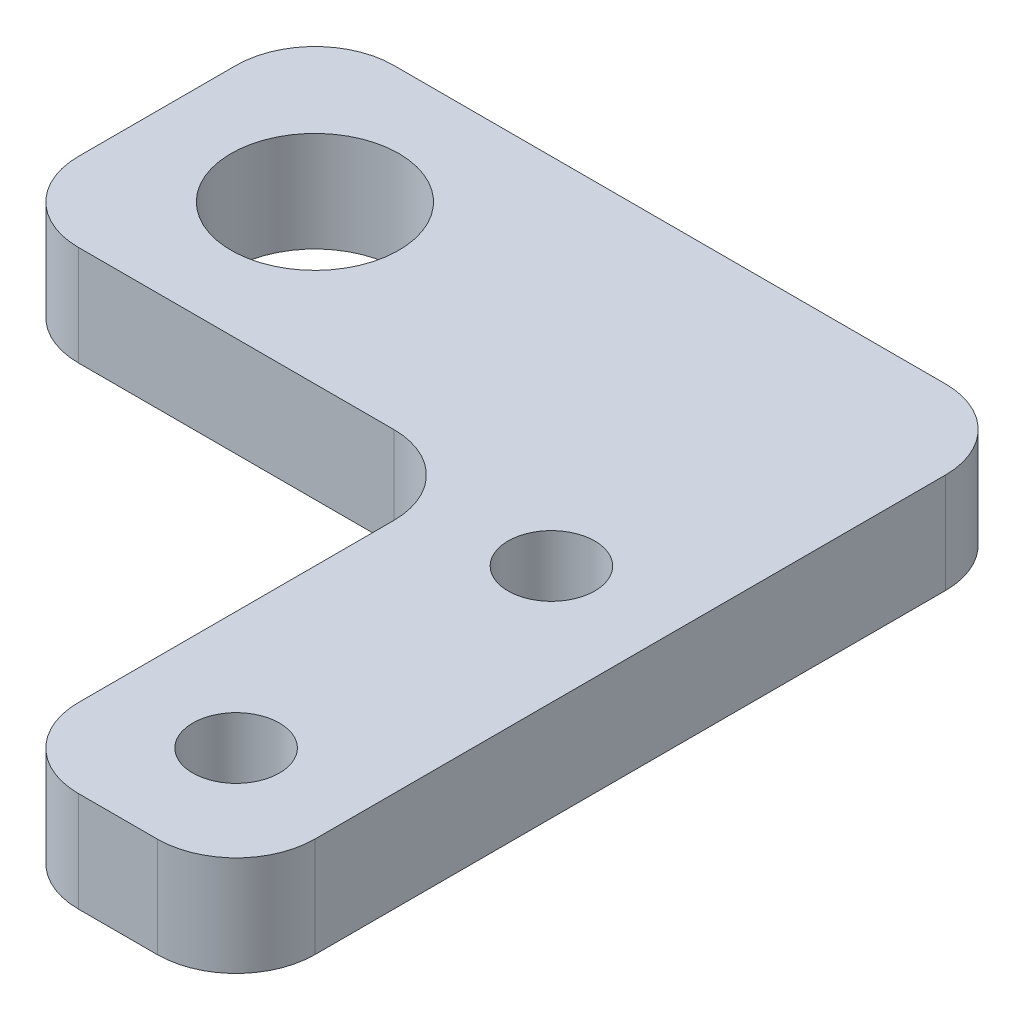
ISO-10303-21;
HEADER;
FILE_DESCRIPTION(('STEP AP214'),'2;1');
FILE_NAME('part.step','',(''),(''),'','','');
FILE_SCHEMA(('AUTOMOTIVE_DESIGN { 1 0 10303 214 1 1 1 1 }'));
ENDSEC;
DATA;
#1=APPLICATION_CONTEXT('core data for automotive mechanical design processes');
#2=APPLICATION_PROTOCOL_DEFINITION('international standard','automotive_design',2000,#1);
#3=PRODUCT_CONTEXT('',#1,'mechanical');
#4=PRODUCT('Part','Part','',(#3));
#5=PRODUCT_RELATED_PRODUCT_CATEGORY('part','',(#4));
#6=PRODUCT_DEFINITION_FORMATION('','',#4);
#7=PRODUCT_DEFINITION_CONTEXT('part definition',#1,'design');
#8=PRODUCT_DEFINITION('design','',#6,#7);
#9=PRODUCT_DEFINITION_SHAPE('','',#8);
#10=(LENGTH_UNIT() NAMED_UNIT(*) SI_UNIT(.MILLI.,.METRE.));
#11=(NAMED_UNIT(*) PLANE_ANGLE_UNIT() SI_UNIT($,.RADIAN.));
#12=(NAMED_UNIT(*) SI_UNIT($,.STERADIAN.) SOLID_ANGLE_UNIT());
#13=UNCERTAINTY_MEASURE_WITH_UNIT(LENGTH_MEASURE(1.E-05),#10,'distance_accuracy_value','');
#14=(GEOMETRIC_REPRESENTATION_CONTEXT(3) GLOBAL_UNCERTAINTY_ASSIGNED_CONTEXT((#13)) GLOBAL_UNIT_ASSIGNED_CONTEXT((#10,
#11,#12)) REPRESENTATION_CONTEXT('',''));
#15=CARTESIAN_POINT('',(0.,0.,0.));
#16=DIRECTION('',(0.,0.,1.));
#17=DIRECTION('',(1.,0.,0.));
#18=AXIS2_PLACEMENT_3D('',#15,#16,#17);
#19=CARTESIAN_POINT('',(486.716259782273,6.35,239.350956887398));
#20=DIRECTION('',(0.,1.,0.));
#21=DIRECTION('',(1.,0.,0.));
#22=AXIS2_PLACEMENT_3D('',#19,#20,#21);
#23=PLANE('',#22);
#24=CARTESIAN_POINT('',(474.216259782273,6.35,224.350956887398));
#25=DIRECTION('',(0.,-1.,0.));
#26=DIRECTION('',(0.,0.,1.));
#27=AXIS2_PLACEMENT_3D('',#24,#25,#26);
#28=CIRCLE('',#27,5.3213);
#29=CARTESIAN_POINT('',(474.216259782273,6.35,219.029656887398));
#30=VERTEX_POINT('',#29);
#31=EDGE_CURVE('E324',#30,#30,#28,.T.);
#32=ORIENTED_EDGE('',*,*,#31,.T.);
#33=EDGE_LOOP('',(#32));
#34=FACE_BOUND('',#33,.T.);
#35=CARTESIAN_POINT('',(501.716259782273,6.35,256.850956887398));
#36=DIRECTION('',(0.,-1.,0.));
#37=DIRECTION('',(0.,0.,1.));
#38=AXIS2_PLACEMENT_3D('',#35,#36,#37);
#39=CIRCLE('',#38,2.75);
#40=CARTESIAN_POINT('',(501.716259782273,6.35,254.100956887398));
#41=VERTEX_POINT('',#40);
#42=EDGE_CURVE('E202',#41,#41,#39,.T.);
#43=ORIENTED_EDGE('',*,*,#42,.T.);
#44=EDGE_LOOP('',(#43));
#45=FACE_BOUND('',#44,.T.);
#46=CARTESIAN_POINT('',(501.716259782273,6.35,236.850956887398));
#47=DIRECTION('',(0.,-1.,0.));
#48=DIRECTION('',(0.,0.,1.));
#49=AXIS2_PLACEMENT_3D('',#46,#47,#48);
#50=CIRCLE('',#49,2.75);
#51=CARTESIAN_POINT('',(501.716259782273,6.35,234.100956887398));
#52=VERTEX_POINT('',#51);
#53=EDGE_CURVE('E320',#52,#52,#50,.T.);
#54=ORIENTED_EDGE('',*,*,#53,.T.);
#55=EDGE_LOOP('',(#54));
#56=FACE_BOUND('',#55,.T.);
#57=CARTESIAN_POINT('',(504.216259782273,6.35,259.350956887398));
#58=DIRECTION('',(0.,-1.,0.));
#59=DIRECTION('',(0.707106781186548,0.,0.707106781186548));
#60=AXIS2_PLACEMENT_3D('',#57,#58,#59);
#61=CIRCLE('',#60,5.);
#62=CARTESIAN_POINT('',(509.216259782273,6.35,259.350956887398));
#63=VERTEX_POINT('',#62);
#64=CARTESIAN_POINT('',(504.216259782273,6.35,264.350956887398));
#65=VERTEX_POINT('',#64);
#66=EDGE_CURVE('E218',#63,#65,#61,.T.);
#67=ORIENTED_EDGE('',*,*,#66,.F.);
#68=DIRECTION('',(0.,0.,-1.));
#69=VECTOR('',#68,1.);
#70=CARTESIAN_POINT('',(509.216259782273,6.35,214.350956887398));
#71=LINE('',#70,#69);
#72=CARTESIAN_POINT('',(509.216259782273,6.35,219.350956887398));
#73=VERTEX_POINT('',#72);
#74=EDGE_CURVE('E10',#63,#73,#71,.T.);
#75=ORIENTED_EDGE('',*,*,#74,.T.);
#76=CARTESIAN_POINT('',(504.216259782273,6.35,219.350956887398));
#77=DIRECTION('',(0.,-1.,0.));
#78=DIRECTION('',(0.707106781186548,0.,-0.707106781186548));
#79=AXIS2_PLACEMENT_3D('',#76,#77,#78);
#80=CIRCLE('',#79,5.);
#81=CARTESIAN_POINT('',(504.216259782273,6.35,214.350956887398));
#82=VERTEX_POINT('',#81);
#83=EDGE_CURVE('E293',#82,#73,#80,.T.);
#84=ORIENTED_EDGE('',*,*,#83,.F.);
#85=DIRECTION('',(-1.,0.,0.));
#86=VECTOR('',#85,1.);
#87=CARTESIAN_POINT('',(464.216259782273,6.35,214.350956887398));
#88=LINE('',#87,#86);
#89=CARTESIAN_POINT('',(469.216259782273,6.35,214.350956887398));
#90=VERTEX_POINT('',#89);
#91=EDGE_CURVE('E224',#82,#90,#88,.T.);
#92=ORIENTED_EDGE('',*,*,#91,.T.);
#93=CARTESIAN_POINT('',(469.216259782273,6.35,219.350956887398));
#94=DIRECTION('',(0.,-1.,0.));
#95=DIRECTION('',(-0.707106781186548,0.,-0.707106781186548));
#96=AXIS2_PLACEMENT_3D('',#93,#94,#95);
#97=CIRCLE('',#96,5.);
#98=CARTESIAN_POINT('',(464.216259782273,6.35,219.350956887398));
#99=VERTEX_POINT('',#98);
#100=EDGE_CURVE('E227',#99,#90,#97,.T.);
#101=ORIENTED_EDGE('',*,*,#100,.F.);
#102=DIRECTION('',(0.,0.,1.));
#103=VECTOR('',#102,1.);
#104=CARTESIAN_POINT('',(464.216259782273,6.35,264.350956887398));
#105=LINE('',#104,#103);
#106=CARTESIAN_POINT('',(464.216259782273,6.35,229.350956887398));
#107=VERTEX_POINT('',#106);
#108=EDGE_CURVE('E264',#99,#107,#105,.T.);
#109=ORIENTED_EDGE('',*,*,#108,.T.);
#110=CARTESIAN_POINT('',(469.216259782273,6.35,229.350956887398));
#111=DIRECTION('',(0.,-1.,0.));
#112=DIRECTION('',(-0.707106781186548,0.,0.707106781186548));
#113=AXIS2_PLACEMENT_3D('',#110,#111,#112);
#114=CIRCLE('',#113,5.);
#115=CARTESIAN_POINT('',(469.216259782273,6.35,234.350956887398));
#116=VERTEX_POINT('',#115);
#117=EDGE_CURVE('E265',#116,#107,#114,.T.);
#118=ORIENTED_EDGE('',*,*,#117,.F.);
#119=DIRECTION('',(1.,0.,0.));
#120=VECTOR('',#119,1.);
#121=CARTESIAN_POINT('',(494.216259782273,6.35,234.350956887398));
#122=LINE('',#121,#120);
#123=CARTESIAN_POINT('',(489.216259782273,6.35,234.350956887398));
#124=VERTEX_POINT('',#123);
#125=EDGE_CURVE('E24',#116,#124,#122,.T.);
#126=ORIENTED_EDGE('',*,*,#125,.T.);
#127=CARTESIAN_POINT('',(489.216259782273,6.35,239.350956887398));
#128=DIRECTION('',(0.,1.,0.));
#129=DIRECTION('',(0.707106781186548,0.,-0.707106781186548));
#130=AXIS2_PLACEMENT_3D('',#127,#128,#129);
#131=CIRCLE('',#130,5.);
#132=CARTESIAN_POINT('',(494.216259782273,6.35,239.350956887398));
#133=VERTEX_POINT('',#132);
#134=EDGE_CURVE('E185',#133,#124,#131,.T.);
#135=ORIENTED_EDGE('',*,*,#134,.F.);
#136=DIRECTION('',(0.,0.,1.));
#137=VECTOR('',#136,1.);
#138=CARTESIAN_POINT('',(494.216259782273,6.35,264.350956887398));
#139=LINE('',#138,#137);
#140=CARTESIAN_POINT('',(494.216259782273,6.35,259.350956887398));
#141=VERTEX_POINT('',#140);
#142=EDGE_CURVE('E235',#133,#141,#139,.T.);
#143=ORIENTED_EDGE('',*,*,#142,.T.);
#144=CARTESIAN_POINT('',(499.216259782273,6.35,259.350956887398));
#145=DIRECTION('',(0.,-1.,0.));
#146=DIRECTION('',(-0.707106781186548,0.,0.707106781186548));
#147=AXIS2_PLACEMENT_3D('',#144,#145,#146);
#148=CIRCLE('',#147,5.);
#149=CARTESIAN_POINT('',(499.216259782273,6.35,264.350956887398));
#150=VERTEX_POINT('',#149);
#151=EDGE_CURVE('E289',#150,#141,#148,.T.);
#152=ORIENTED_EDGE('',*,*,#151,.F.);
#153=DIRECTION('',(1.,0.,0.));
#154=VECTOR('',#153,1.);
#155=CARTESIAN_POINT('',(509.216259782273,6.35,264.350956887398));
#156=LINE('',#155,#154);
#157=EDGE_CURVE('E284',#150,#65,#156,.T.);
#158=ORIENTED_EDGE('',*,*,#157,.T.);
#159=EDGE_LOOP('',(#67,#75,#84,#92,#101,#109,#118,#126,#135,#143,#152,#158));
#160=FACE_BOUND('',#159,.T.);
#161=ADVANCED_FACE('F16',(#34,#45,#56,#160),#23,.T.);
#162=CARTESIAN_POINT('',(509.216259782273,0.,264.350956887398));
#163=DIRECTION('',(1.,0.,0.));
#164=DIRECTION('',(0.,1.,0.));
#165=AXIS2_PLACEMENT_3D('',#162,#163,#164);
#166=PLANE('',#165);
#167=DIRECTION('',(0.,1.,0.));
#168=VECTOR('',#167,1.);
#169=CARTESIAN_POINT('',(509.216259782273,0.,259.350956887398));
#170=LINE('',#169,#168);
#171=CARTESIAN_POINT('',(509.216259782273,0.,259.350956887398));
#172=VERTEX_POINT('',#171);
#173=EDGE_CURVE('E213',#172,#63,#170,.T.);
#174=ORIENTED_EDGE('',*,*,#173,.F.);
#175=DIRECTION('',(0.,0.,1.));
#176=VECTOR('',#175,1.);
#177=CARTESIAN_POINT('',(509.216259782273,0.,214.350956887398));
#178=LINE('',#177,#176);
#179=CARTESIAN_POINT('',(509.216259782273,0.,219.350956887398));
#180=VERTEX_POINT('',#179);
#181=EDGE_CURVE('E261',#180,#172,#178,.T.);
#182=ORIENTED_EDGE('',*,*,#181,.F.);
#183=DIRECTION('',(0.,-1.,0.));
#184=VECTOR('',#183,1.);
#185=CARTESIAN_POINT('',(509.216259782273,0.,219.350956887398));
#186=LINE('',#185,#184);
#187=EDGE_CURVE('E300',#73,#180,#186,.T.);
#188=ORIENTED_EDGE('',*,*,#187,.F.);
#189=ORIENTED_EDGE('',*,*,#74,.F.);
#190=EDGE_LOOP('',(#174,#182,#188,#189));
#191=FACE_BOUND('',#190,.T.);
#192=ADVANCED_FACE('F360',(#191),#166,.T.);
#193=CARTESIAN_POINT('',(464.216259782273,0.,234.350956887398));
#194=DIRECTION('',(0.,0.,1.));
#195=DIRECTION('',(1.,0.,0.));
#196=AXIS2_PLACEMENT_3D('',#193,#194,#195);
#197=PLANE('',#196);
#198=DIRECTION('',(0.,-1.,0.));
#199=VECTOR('',#198,1.);
#200=CARTESIAN_POINT('',(489.216259782273,0.,234.350956887398));
#201=LINE('',#200,#199);
#202=CARTESIAN_POINT('',(489.216259782273,0.,234.350956887398));
#203=VERTEX_POINT('',#202);
#204=EDGE_CURVE('E162',#124,#203,#201,.T.);
#205=ORIENTED_EDGE('',*,*,#204,.F.);
#206=ORIENTED_EDGE('',*,*,#125,.F.);
#207=DIRECTION('',(0.,1.,0.));
#208=VECTOR('',#207,1.);
#209=CARTESIAN_POINT('',(469.216259782273,0.,234.350956887398));
#210=LINE('',#209,#208);
#211=CARTESIAN_POINT('',(469.216259782273,0.,234.350956887398));
#212=VERTEX_POINT('',#211);
#213=EDGE_CURVE('E167',#212,#116,#210,.T.);
#214=ORIENTED_EDGE('',*,*,#213,.F.);
#215=DIRECTION('',(-1.,0.,0.));
#216=VECTOR('',#215,1.);
#217=CARTESIAN_POINT('',(494.216259782273,0.,234.350956887398));
#218=LINE('',#217,#216);
#219=EDGE_CURVE('E159',#203,#212,#218,.T.);
#220=ORIENTED_EDGE('',*,*,#219,.F.);
#221=EDGE_LOOP('',(#205,#206,#214,#220));
#222=FACE_BOUND('',#221,.T.);
#223=ADVANCED_FACE('F165',(#222),#197,.T.);
#224=CARTESIAN_POINT('',(474.216259782273,-3.175,224.350956887398));
#225=DIRECTION('',(0.,-1.,0.));
#226=DIRECTION('',(0.,0.,1.));
#227=AXIS2_PLACEMENT_3D('',#224,#225,#226);
#228=CYLINDRICAL_SURFACE('',#227,5.3213);
#229=ORIENTED_EDGE('',*,*,#31,.F.);
#230=DIRECTION('',(0.,-1.,0.));
#231=VECTOR('',#230,1.);
#232=CARTESIAN_POINT('',(474.216259782273,-3.175,219.029656887398));
#233=LINE('',#232,#231);
#234=CARTESIAN_POINT('',(474.216259782273,0.,219.029656887398));
#235=VERTEX_POINT('',#234);
#236=EDGE_CURVE('E38',#30,#235,#233,.T.);
#237=ORIENTED_EDGE('',*,*,#236,.T.);
#238=CARTESIAN_POINT('',(474.216259782273,0.,224.350956887398));
#239=DIRECTION('',(0.,1.,0.));
#240=DIRECTION('',(0.,0.,1.));
#241=AXIS2_PLACEMENT_3D('',#238,#239,#240);
#242=CIRCLE('',#241,5.3213);
#243=EDGE_CURVE('E268',#235,#235,#242,.T.);
#244=ORIENTED_EDGE('',*,*,#243,.F.);
#245=ORIENTED_EDGE('',*,*,#236,.F.);
#246=EDGE_LOOP('',(#229,#237,#244,#245));
#247=FACE_BOUND('',#246,.T.);
#248=ADVANCED_FACE('F398',(#247),#228,.F.);
#249=CARTESIAN_POINT('',(501.716259782273,-5.87374999999971,256.850956887398));
#250=DIRECTION('',(0.,-1.,0.));
#251=DIRECTION('',(0.,0.,1.));
#252=AXIS2_PLACEMENT_3D('',#249,#250,#251);
#253=CYLINDRICAL_SURFACE('',#252,2.75);
#254=ORIENTED_EDGE('',*,*,#42,.F.);
#255=DIRECTION('',(0.,-1.,0.));
#256=VECTOR('',#255,1.);
#257=CARTESIAN_POINT('',(501.716259782273,-5.87374999999971,254.100956887398));
#258=LINE('',#257,#256);
#259=CARTESIAN_POINT('',(501.716259782273,0.,254.100956887398));
#260=VERTEX_POINT('',#259);
#261=EDGE_CURVE('E46',#41,#260,#258,.T.);
#262=ORIENTED_EDGE('',*,*,#261,.T.);
#263=CARTESIAN_POINT('',(501.716259782273,0.,256.850956887398));
#264=DIRECTION('',(0.,1.,0.));
#265=DIRECTION('',(0.,0.,1.));
#266=AXIS2_PLACEMENT_3D('',#263,#264,#265);
#267=CIRCLE('',#266,2.75);
#268=EDGE_CURVE('E274',#260,#260,#267,.T.);
#269=ORIENTED_EDGE('',*,*,#268,.F.);
#270=ORIENTED_EDGE('',*,*,#261,.F.);
#271=EDGE_LOOP('',(#254,#262,#269,#270));
#272=FACE_BOUND('',#271,.T.);
#273=ADVANCED_FACE('F399',(#272),#253,.F.);
#274=CARTESIAN_POINT('',(501.716259782273,-5.87374999999971,236.850956887398));
#275=DIRECTION('',(0.,-1.,0.));
#276=DIRECTION('',(0.,0.,1.));
#277=AXIS2_PLACEMENT_3D('',#274,#275,#276);
#278=CYLINDRICAL_SURFACE('',#277,2.75);
#279=ORIENTED_EDGE('',*,*,#53,.F.);
#280=DIRECTION('',(0.,-1.,0.));
#281=VECTOR('',#280,1.);
#282=CARTESIAN_POINT('',(501.716259782273,-5.87374999999971,234.100956887398));
#283=LINE('',#282,#281);
#284=CARTESIAN_POINT('',(501.716259782273,0.,234.100956887398));
#285=VERTEX_POINT('',#284);
#286=EDGE_CURVE('E208',#52,#285,#283,.T.);
#287=ORIENTED_EDGE('',*,*,#286,.T.);
#288=CARTESIAN_POINT('',(501.716259782273,0.,236.850956887398));
#289=DIRECTION('',(0.,1.,0.));
#290=DIRECTION('',(0.,0.,1.));
#291=AXIS2_PLACEMENT_3D('',#288,#289,#290);
#292=CIRCLE('',#291,2.75);
#293=EDGE_CURVE('E276',#285,#285,#292,.T.);
#294=ORIENTED_EDGE('',*,*,#293,.F.);
#295=ORIENTED_EDGE('',*,*,#286,.F.);
#296=EDGE_LOOP('',(#279,#287,#294,#295));
#297=FACE_BOUND('',#296,.T.);
#298=ADVANCED_FACE('F391',(#297),#278,.F.);
#299=CARTESIAN_POINT('',(469.216259782273,0.,229.350956887398));
#300=DIRECTION('',(0.,1.,0.));
#301=DIRECTION('',(-0.707106781186548,0.,0.707106781186548));
#302=AXIS2_PLACEMENT_3D('',#299,#300,#301);
#303=CYLINDRICAL_SURFACE('',#302,5.);
#304=ORIENTED_EDGE('',*,*,#117,.T.);
#305=DIRECTION('',(0.,-1.,0.));
#306=VECTOR('',#305,1.);
#307=CARTESIAN_POINT('',(464.216259782273,0.,229.350956887398));
#308=LINE('',#307,#306);
#309=CARTESIAN_POINT('',(464.216259782273,0.,229.350956887398));
#310=VERTEX_POINT('',#309);
#311=EDGE_CURVE('E310',#107,#310,#308,.T.);
#312=ORIENTED_EDGE('',*,*,#311,.T.);
#313=CARTESIAN_POINT('',(469.216259782273,0.,229.350956887398));
#314=DIRECTION('',(0.,1.,0.));
#315=DIRECTION('',(-0.707106781186548,0.,0.707106781186548));
#316=AXIS2_PLACEMENT_3D('',#313,#314,#315);
#317=CIRCLE('',#316,5.);
#318=EDGE_CURVE('E172',#310,#212,#317,.T.);
#319=ORIENTED_EDGE('',*,*,#318,.T.);
#320=ORIENTED_EDGE('',*,*,#213,.T.);
#321=EDGE_LOOP('',(#304,#312,#319,#320));
#322=FACE_BOUND('',#321,.T.);
#323=ADVANCED_FACE('F336',(#322),#303,.T.);
#324=CARTESIAN_POINT('',(464.216259782273,0.,214.350956887398));
#325=DIRECTION('',(-1.,0.,0.));
#326=DIRECTION('',(0.,0.,1.));
#327=AXIS2_PLACEMENT_3D('',#324,#325,#326);
#328=PLANE('',#327);
#329=DIRECTION('',(0.,1.,0.));
#330=VECTOR('',#329,1.);
#331=CARTESIAN_POINT('',(464.216259782273,0.,219.350956887398));
#332=LINE('',#331,#330);
#333=CARTESIAN_POINT('',(464.216259782273,0.,219.350956887398));
#334=VERTEX_POINT('',#333);
#335=EDGE_CURVE('E304',#334,#99,#332,.T.);
#336=ORIENTED_EDGE('',*,*,#335,.F.);
#337=DIRECTION('',(0.,0.,-1.));
#338=VECTOR('',#337,1.);
#339=CARTESIAN_POINT('',(464.216259782273,0.,264.350956887398));
#340=LINE('',#339,#338);
#341=EDGE_CURVE('E199',#310,#334,#340,.T.);
#342=ORIENTED_EDGE('',*,*,#341,.F.);
#343=ORIENTED_EDGE('',*,*,#311,.F.);
#344=ORIENTED_EDGE('',*,*,#108,.F.);
#345=EDGE_LOOP('',(#336,#342,#343,#344));
#346=FACE_BOUND('',#345,.T.);
#347=ADVANCED_FACE('F341',(#346),#328,.T.);
#348=CARTESIAN_POINT('',(469.216259782273,0.,219.350956887398));
#349=DIRECTION('',(0.,1.,0.));
#350=DIRECTION('',(-0.707106781186548,0.,-0.707106781186548));
#351=AXIS2_PLACEMENT_3D('',#348,#349,#350);
#352=CYLINDRICAL_SURFACE('',#351,5.);
#353=ORIENTED_EDGE('',*,*,#100,.T.);
#354=DIRECTION('',(0.,-1.,0.));
#355=VECTOR('',#354,1.);
#356=CARTESIAN_POINT('',(469.216259782273,0.,214.350956887398));
#357=LINE('',#356,#355);
#358=CARTESIAN_POINT('',(469.216259782273,0.,214.350956887398));
#359=VERTEX_POINT('',#358);
#360=EDGE_CURVE('E229',#90,#359,#357,.T.);
#361=ORIENTED_EDGE('',*,*,#360,.T.);
#362=CARTESIAN_POINT('',(469.216259782273,0.,219.350956887398));
#363=DIRECTION('',(0.,1.,0.));
#364=DIRECTION('',(-0.707106781186548,0.,-0.707106781186548));
#365=AXIS2_PLACEMENT_3D('',#362,#363,#364);
#366=CIRCLE('',#365,5.);
#367=EDGE_CURVE('E204',#359,#334,#366,.T.);
#368=ORIENTED_EDGE('',*,*,#367,.T.);
#369=ORIENTED_EDGE('',*,*,#335,.T.);
#370=EDGE_LOOP('',(#353,#361,#368,#369));
#371=FACE_BOUND('',#370,.T.);
#372=ADVANCED_FACE('F342',(#371),#352,.T.);
#373=CARTESIAN_POINT('',(509.216259782273,0.,214.350956887398));
#374=DIRECTION('',(0.,0.,-1.));
#375=DIRECTION('',(0.,-1.,0.));
#376=AXIS2_PLACEMENT_3D('',#373,#374,#375);
#377=PLANE('',#376);
#378=DIRECTION('',(0.,1.,0.));
#379=VECTOR('',#378,1.);
#380=CARTESIAN_POINT('',(504.216259782273,0.,214.350956887398));
#381=LINE('',#380,#379);
#382=CARTESIAN_POINT('',(504.216259782273,0.,214.350956887398));
#383=VERTEX_POINT('',#382);
#384=EDGE_CURVE('E271',#383,#82,#381,.T.);
#385=ORIENTED_EDGE('',*,*,#384,.F.);
#386=DIRECTION('',(1.,0.,0.));
#387=VECTOR('',#386,1.);
#388=CARTESIAN_POINT('',(464.216259782273,0.,214.350956887398));
#389=LINE('',#388,#387);
#390=EDGE_CURVE('E251',#359,#383,#389,.T.);
#391=ORIENTED_EDGE('',*,*,#390,.F.);
#392=ORIENTED_EDGE('',*,*,#360,.F.);
#393=ORIENTED_EDGE('',*,*,#91,.F.);
#394=EDGE_LOOP('',(#385,#391,#392,#393));
#395=FACE_BOUND('',#394,.T.);
#396=ADVANCED_FACE('F348',(#395),#377,.T.);
#397=CARTESIAN_POINT('',(504.216259782273,0.,219.350956887398));
#398=DIRECTION('',(0.,1.,0.));
#399=DIRECTION('',(0.707106781186548,0.,-0.707106781186548));
#400=AXIS2_PLACEMENT_3D('',#397,#398,#399);
#401=CYLINDRICAL_SURFACE('',#400,5.);
#402=ORIENTED_EDGE('',*,*,#83,.T.);
#403=ORIENTED_EDGE('',*,*,#187,.T.);
#404=CARTESIAN_POINT('',(504.216259782273,0.,219.350956887398));
#405=DIRECTION('',(0.,1.,0.));
#406=DIRECTION('',(0.707106781186548,0.,-0.707106781186548));
#407=AXIS2_PLACEMENT_3D('',#404,#405,#406);
#408=CIRCLE('',#407,5.);
#409=EDGE_CURVE('E260',#180,#383,#408,.T.);
#410=ORIENTED_EDGE('',*,*,#409,.T.);
#411=ORIENTED_EDGE('',*,*,#384,.T.);
#412=EDGE_LOOP('',(#402,#403,#410,#411));
#413=FACE_BOUND('',#412,.T.);
#414=ADVANCED_FACE('F352',(#413),#401,.T.);
#415=CARTESIAN_POINT('',(499.216259782273,0.,259.350956887398));
#416=DIRECTION('',(0.,1.,0.));
#417=DIRECTION('',(-0.707106781186548,0.,0.707106781186548));
#418=AXIS2_PLACEMENT_3D('',#415,#416,#417);
#419=CYLINDRICAL_SURFACE('',#418,5.);
#420=ORIENTED_EDGE('',*,*,#151,.T.);
#421=DIRECTION('',(0.,-1.,0.));
#422=VECTOR('',#421,1.);
#423=CARTESIAN_POINT('',(494.216259782273,0.,259.350956887398));
#424=LINE('',#423,#422);
#425=CARTESIAN_POINT('',(494.216259782273,0.,259.350956887398));
#426=VERTEX_POINT('',#425);
#427=EDGE_CURVE('E225',#141,#426,#424,.T.);
#428=ORIENTED_EDGE('',*,*,#427,.T.);
#429=CARTESIAN_POINT('',(499.216259782273,0.,259.350956887398));
#430=DIRECTION('',(0.,1.,0.));
#431=DIRECTION('',(-0.707106781186548,0.,0.707106781186548));
#432=AXIS2_PLACEMENT_3D('',#429,#430,#431);
#433=CIRCLE('',#432,5.);
#434=CARTESIAN_POINT('',(499.216259782273,0.,264.350956887398));
#435=VERTEX_POINT('',#434);
#436=EDGE_CURVE('E174',#426,#435,#433,.T.);
#437=ORIENTED_EDGE('',*,*,#436,.T.);
#438=DIRECTION('',(0.,1.,0.));
#439=VECTOR('',#438,1.);
#440=CARTESIAN_POINT('',(499.216259782273,0.,264.350956887398));
#441=LINE('',#440,#439);
#442=EDGE_CURVE('E286',#435,#150,#441,.T.);
#443=ORIENTED_EDGE('',*,*,#442,.T.);
#444=EDGE_LOOP('',(#420,#428,#437,#443));
#445=FACE_BOUND('',#444,.T.);
#446=ADVANCED_FACE('F364',(#445),#419,.T.);
#447=CARTESIAN_POINT('',(494.216259782273,0.,264.350956887398));
#448=DIRECTION('',(0.,0.,1.));
#449=DIRECTION('',(1.,0.,0.));
#450=AXIS2_PLACEMENT_3D('',#447,#448,#449);
#451=PLANE('',#450);
#452=DIRECTION('',(0.,-1.,0.));
#453=VECTOR('',#452,1.);
#454=CARTESIAN_POINT('',(504.216259782273,0.,264.350956887398));
#455=LINE('',#454,#453);
#456=CARTESIAN_POINT('',(504.216259782273,0.,264.350956887398));
#457=VERTEX_POINT('',#456);
#458=EDGE_CURVE('E212',#65,#457,#455,.T.);
#459=ORIENTED_EDGE('',*,*,#458,.F.);
#460=ORIENTED_EDGE('',*,*,#157,.F.);
#461=ORIENTED_EDGE('',*,*,#442,.F.);
#462=DIRECTION('',(-1.,0.,0.));
#463=VECTOR('',#462,1.);
#464=CARTESIAN_POINT('',(509.216259782273,0.,264.350956887398));
#465=LINE('',#464,#463);
#466=EDGE_CURVE('E207',#457,#435,#465,.T.);
#467=ORIENTED_EDGE('',*,*,#466,.F.);
#468=EDGE_LOOP('',(#459,#460,#461,#467));
#469=FACE_BOUND('',#468,.T.);
#470=ADVANCED_FACE('F362',(#469),#451,.T.);
#471=CARTESIAN_POINT('',(486.716259782273,0.,239.350956887398));
#472=DIRECTION('',(0.,1.,0.));
#473=DIRECTION('',(1.,0.,0.));
#474=AXIS2_PLACEMENT_3D('',#471,#472,#473);
#475=PLANE('',#474);
#476=ORIENTED_EDGE('',*,*,#293,.T.);
#477=EDGE_LOOP('',(#476));
#478=FACE_BOUND('',#477,.T.);
#479=ORIENTED_EDGE('',*,*,#268,.T.);
#480=EDGE_LOOP('',(#479));
#481=FACE_BOUND('',#480,.T.);
#482=ORIENTED_EDGE('',*,*,#243,.T.);
#483=EDGE_LOOP('',(#482));
#484=FACE_BOUND('',#483,.T.);
#485=CARTESIAN_POINT('',(504.216259782273,0.,259.350956887398));
#486=DIRECTION('',(0.,1.,0.));
#487=DIRECTION('',(0.707106781186548,0.,0.707106781186548));
#488=AXIS2_PLACEMENT_3D('',#485,#486,#487);
#489=CIRCLE('',#488,5.);
#490=EDGE_CURVE('E217',#457,#172,#489,.T.);
#491=ORIENTED_EDGE('',*,*,#490,.F.);
#492=ORIENTED_EDGE('',*,*,#466,.T.);
#493=ORIENTED_EDGE('',*,*,#436,.F.);
#494=DIRECTION('',(0.,0.,-1.));
#495=VECTOR('',#494,1.);
#496=CARTESIAN_POINT('',(494.216259782273,0.,264.350956887398));
#497=LINE('',#496,#495);
#498=CARTESIAN_POINT('',(494.216259782273,0.,239.350956887398));
#499=VERTEX_POINT('',#498);
#500=EDGE_CURVE('E183',#426,#499,#497,.T.);
#501=ORIENTED_EDGE('',*,*,#500,.T.);
#502=CARTESIAN_POINT('',(489.216259782273,0.,239.350956887398));
#503=DIRECTION('',(0.,-1.,0.));
#504=DIRECTION('',(0.707106781186548,0.,-0.707106781186548));
#505=AXIS2_PLACEMENT_3D('',#502,#503,#504);
#506=CIRCLE('',#505,5.);
#507=EDGE_CURVE('E177',#203,#499,#506,.T.);
#508=ORIENTED_EDGE('',*,*,#507,.F.);
#509=ORIENTED_EDGE('',*,*,#219,.T.);
#510=ORIENTED_EDGE('',*,*,#318,.F.);
#511=ORIENTED_EDGE('',*,*,#341,.T.);
#512=ORIENTED_EDGE('',*,*,#367,.F.);
#513=ORIENTED_EDGE('',*,*,#390,.T.);
#514=ORIENTED_EDGE('',*,*,#409,.F.);
#515=ORIENTED_EDGE('',*,*,#181,.T.);
#516=EDGE_LOOP('',(#491,#492,#493,#501,#508,#509,#510,#511,#512,#513,#514,#515));
#517=FACE_BOUND('',#516,.T.);
#518=ADVANCED_FACE('F186',(#478,#481,#484,#517),#475,.F.);
#519=CARTESIAN_POINT('',(504.216259782273,0.,259.350956887398));
#520=DIRECTION('',(0.,1.,0.));
#521=DIRECTION('',(0.707106781186548,0.,0.707106781186548));
#522=AXIS2_PLACEMENT_3D('',#519,#520,#521);
#523=CYLINDRICAL_SURFACE('',#522,5.);
#524=ORIENTED_EDGE('',*,*,#66,.T.);
#525=ORIENTED_EDGE('',*,*,#458,.T.);
#526=ORIENTED_EDGE('',*,*,#490,.T.);
#527=ORIENTED_EDGE('',*,*,#173,.T.);
#528=EDGE_LOOP('',(#524,#525,#526,#527));
#529=FACE_BOUND('',#528,.T.);
#530=ADVANCED_FACE('F357',(#529),#523,.T.);
#531=CARTESIAN_POINT('',(494.216259782273,0.,234.350956887398));
#532=DIRECTION('',(-1.,0.,0.));
#533=DIRECTION('',(0.,0.,1.));
#534=AXIS2_PLACEMENT_3D('',#531,#532,#533);
#535=PLANE('',#534);
#536=DIRECTION('',(0.,1.,0.));
#537=VECTOR('',#536,1.);
#538=CARTESIAN_POINT('',(494.216259782273,0.,239.350956887398));
#539=LINE('',#538,#537);
#540=EDGE_CURVE('E189',#499,#133,#539,.T.);
#541=ORIENTED_EDGE('',*,*,#540,.F.);
#542=ORIENTED_EDGE('',*,*,#500,.F.);
#543=ORIENTED_EDGE('',*,*,#427,.F.);
#544=ORIENTED_EDGE('',*,*,#142,.F.);
#545=EDGE_LOOP('',(#541,#542,#543,#544));
#546=FACE_BOUND('',#545,.T.);
#547=ADVANCED_FACE('F366',(#546),#535,.T.);
#548=CARTESIAN_POINT('',(489.216259782273,0.,239.350956887398));
#549=DIRECTION('',(0.,1.,0.));
#550=DIRECTION('',(0.707106781186548,0.,-0.707106781186548));
#551=AXIS2_PLACEMENT_3D('',#548,#549,#550);
#552=CYLINDRICAL_SURFACE('',#551,5.);
#553=ORIENTED_EDGE('',*,*,#507,.T.);
#554=ORIENTED_EDGE('',*,*,#540,.T.);
#555=ORIENTED_EDGE('',*,*,#134,.T.);
#556=ORIENTED_EDGE('',*,*,#204,.T.);
#557=EDGE_LOOP('',(#553,#554,#555,#556));
#558=FACE_BOUND('',#557,.T.);
#559=ADVANCED_FACE('F180',(#558),#552,.F.);
#560=CLOSED_SHELL('',(#161,#192,#223,#248,#273,#298,#323,#347,#372,#396,#414,#446,#470,#518,
#530,#547,#559));
#561=MANIFOLD_SOLID_BREP('B1',#560);
#562=ADVANCED_BREP_SHAPE_REPRESENTATION('',(#18,#561),#14);
#563=SHAPE_DEFINITION_REPRESENTATION(#9,#562);
ENDSEC;
END-ISO-10303-21;
